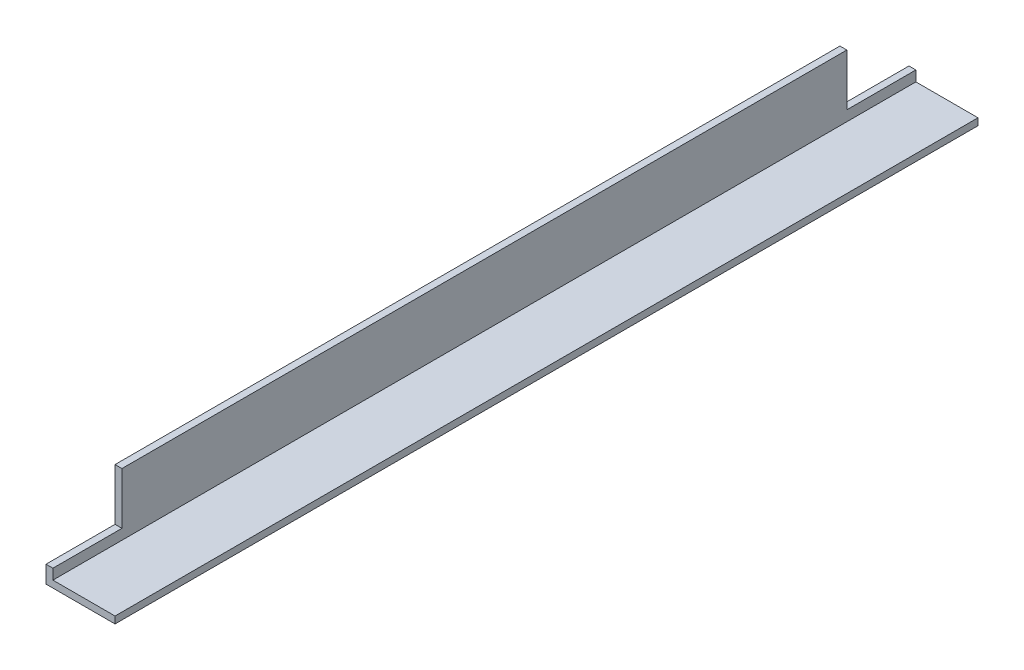
ISO-10303-21;
HEADER;
FILE_DESCRIPTION(('STEP AP214'),'2;1');
FILE_NAME('part.step','',(''),(''),'','','');
FILE_SCHEMA(('AUTOMOTIVE_DESIGN { 1 0 10303 214 1 1 1 1 }'));
ENDSEC;
DATA;
#1=APPLICATION_CONTEXT('core data for automotive mechanical design processes');
#2=APPLICATION_PROTOCOL_DEFINITION('international standard','automotive_design',2000,#1);
#3=PRODUCT_CONTEXT('',#1,'mechanical');
#4=PRODUCT('Part','Part','',(#3));
#5=PRODUCT_RELATED_PRODUCT_CATEGORY('part','',(#4));
#6=PRODUCT_DEFINITION_FORMATION('','',#4);
#7=PRODUCT_DEFINITION_CONTEXT('part definition',#1,'design');
#8=PRODUCT_DEFINITION('design','',#6,#7);
#9=PRODUCT_DEFINITION_SHAPE('','',#8);
#10=(LENGTH_UNIT() NAMED_UNIT(*) SI_UNIT(.MILLI.,.METRE.));
#11=(NAMED_UNIT(*) PLANE_ANGLE_UNIT() SI_UNIT($,.RADIAN.));
#12=(NAMED_UNIT(*) SI_UNIT($,.STERADIAN.) SOLID_ANGLE_UNIT());
#13=UNCERTAINTY_MEASURE_WITH_UNIT(LENGTH_MEASURE(1.E-05),#10,'distance_accuracy_value','');
#14=(GEOMETRIC_REPRESENTATION_CONTEXT(3) GLOBAL_UNCERTAINTY_ASSIGNED_CONTEXT((#13)) GLOBAL_UNIT_ASSIGNED_CONTEXT((#10,
#11,#12)) REPRESENTATION_CONTEXT('',''));
#15=CARTESIAN_POINT('',(0.,0.,0.));
#16=DIRECTION('',(0.,0.,1.));
#17=DIRECTION('',(1.,0.,0.));
#18=AXIS2_PLACEMENT_3D('',#15,#16,#17);
#19=CARTESIAN_POINT('',(40.,0.,500.));
#20=DIRECTION('',(0.,1.,0.));
#21=DIRECTION('',(-1.,0.,0.));
#22=AXIS2_PLACEMENT_3D('',#19,#20,#21);
#23=PLANE('',#22);
#24=DIRECTION('',(1.,0.,0.));
#25=VECTOR('',#24,1.);
#26=CARTESIAN_POINT('',(40.,0.,0.));
#27=LINE('',#26,#25);
#28=CARTESIAN_POINT('',(0.,0.,0.));
#29=VERTEX_POINT('',#28);
#30=CARTESIAN_POINT('',(40.,0.,0.));
#31=VERTEX_POINT('',#30);
#32=EDGE_CURVE('E180',#29,#31,#27,.T.);
#33=ORIENTED_EDGE('',*,*,#32,.T.);
#34=DIRECTION('',(0.,0.,-1.));
#35=VECTOR('',#34,1.);
#36=CARTESIAN_POINT('',(40.,0.,500.));
#37=LINE('',#36,#35);
#38=CARTESIAN_POINT('',(40.,0.,500.));
#39=VERTEX_POINT('',#38);
#40=EDGE_CURVE('E160',#39,#31,#37,.T.);
#41=ORIENTED_EDGE('',*,*,#40,.F.);
#42=DIRECTION('',(1.,0.,0.));
#43=VECTOR('',#42,1.);
#44=CARTESIAN_POINT('',(40.,0.,500.));
#45=LINE('',#44,#43);
#46=CARTESIAN_POINT('',(0.,0.,500.));
#47=VERTEX_POINT('',#46);
#48=EDGE_CURVE('E182',#47,#39,#45,.T.);
#49=ORIENTED_EDGE('',*,*,#48,.F.);
#50=DIRECTION('',(0.,0.,-1.));
#51=VECTOR('',#50,1.);
#52=CARTESIAN_POINT('',(0.,0.,500.));
#53=LINE('',#52,#51);
#54=EDGE_CURVE('E142',#47,#29,#53,.T.);
#55=ORIENTED_EDGE('',*,*,#54,.T.);
#56=EDGE_LOOP('',(#33,#41,#49,#55));
#57=FACE_BOUND('',#56,.T.);
#58=ADVANCED_FACE('F38',(#57),#23,.F.);
#59=CARTESIAN_POINT('',(40.,4.,500.));
#60=DIRECTION('',(-1.,0.,0.));
#61=DIRECTION('',(0.,0.,1.));
#62=AXIS2_PLACEMENT_3D('',#59,#60,#61);
#63=PLANE('',#62);
#64=DIRECTION('',(0.,1.,0.));
#65=VECTOR('',#64,1.);
#66=CARTESIAN_POINT('',(40.,4.,0.));
#67=LINE('',#66,#65);
#68=CARTESIAN_POINT('',(40.,4.,0.));
#69=VERTEX_POINT('',#68);
#70=EDGE_CURVE('E194',#31,#69,#67,.T.);
#71=ORIENTED_EDGE('',*,*,#70,.T.);
#72=DIRECTION('',(0.,0.,-1.));
#73=VECTOR('',#72,1.);
#74=CARTESIAN_POINT('',(40.,4.,500.));
#75=LINE('',#74,#73);
#76=CARTESIAN_POINT('',(40.,4.,500.));
#77=VERTEX_POINT('',#76);
#78=EDGE_CURVE('E156',#77,#69,#75,.T.);
#79=ORIENTED_EDGE('',*,*,#78,.F.);
#80=DIRECTION('',(0.,1.,0.));
#81=VECTOR('',#80,1.);
#82=CARTESIAN_POINT('',(40.,4.,500.));
#83=LINE('',#82,#81);
#84=EDGE_CURVE('E187',#39,#77,#83,.T.);
#85=ORIENTED_EDGE('',*,*,#84,.F.);
#86=ORIENTED_EDGE('',*,*,#40,.T.);
#87=EDGE_LOOP('',(#71,#79,#85,#86));
#88=FACE_BOUND('',#87,.T.);
#89=ADVANCED_FACE('F245',(#88),#63,.F.);
#90=CARTESIAN_POINT('',(4.,4.,500.));
#91=DIRECTION('',(0.,-1.,0.));
#92=DIRECTION('',(0.,0.,-1.));
#93=AXIS2_PLACEMENT_3D('',#90,#91,#92);
#94=PLANE('',#93);
#95=DIRECTION('',(-1.,0.,0.));
#96=VECTOR('',#95,1.);
#97=CARTESIAN_POINT('',(4.,4.,0.));
#98=LINE('',#97,#96);
#99=CARTESIAN_POINT('',(4.,4.,0.));
#100=VERTEX_POINT('',#99);
#101=EDGE_CURVE('E189',#69,#100,#98,.T.);
#102=ORIENTED_EDGE('',*,*,#101,.T.);
#103=DIRECTION('',(0.,0.,-1.));
#104=VECTOR('',#103,1.);
#105=CARTESIAN_POINT('',(4.,4.,500.));
#106=LINE('',#105,#104);
#107=CARTESIAN_POINT('',(4.,4.,500.));
#108=VERTEX_POINT('',#107);
#109=EDGE_CURVE('E146',#108,#100,#106,.T.);
#110=ORIENTED_EDGE('',*,*,#109,.F.);
#111=DIRECTION('',(-1.,0.,0.));
#112=VECTOR('',#111,1.);
#113=CARTESIAN_POINT('',(4.,4.,500.));
#114=LINE('',#113,#112);
#115=EDGE_CURVE('E206',#77,#108,#114,.T.);
#116=ORIENTED_EDGE('',*,*,#115,.F.);
#117=ORIENTED_EDGE('',*,*,#78,.T.);
#118=EDGE_LOOP('',(#102,#110,#116,#117));
#119=FACE_BOUND('',#118,.T.);
#120=ADVANCED_FACE('F241',(#119),#94,.F.);
#121=CARTESIAN_POINT('',(4.,40.,500.));
#122=DIRECTION('',(-1.,0.,0.));
#123=DIRECTION('',(0.,-1.,0.));
#124=AXIS2_PLACEMENT_3D('',#121,#122,#123);
#125=PLANE('',#124);
#126=DIRECTION('',(0.,-1.,0.));
#127=VECTOR('',#126,1.);
#128=CARTESIAN_POINT('',(4.,40.,460.));
#129=LINE('',#128,#127);
#130=CARTESIAN_POINT('',(4.,40.,460.));
#131=VERTEX_POINT('',#130);
#132=CARTESIAN_POINT('',(4.,10.,460.));
#133=VERTEX_POINT('',#132);
#134=EDGE_CURVE('E121',#131,#133,#129,.T.);
#135=ORIENTED_EDGE('',*,*,#134,.T.);
#136=DIRECTION('',(0.,0.,1.));
#137=VECTOR('',#136,1.);
#138=CARTESIAN_POINT('',(4.,10.,500.));
#139=LINE('',#138,#137);
#140=CARTESIAN_POINT('',(4.,10.,500.));
#141=VERTEX_POINT('',#140);
#142=EDGE_CURVE('E225',#133,#141,#139,.T.);
#143=ORIENTED_EDGE('',*,*,#142,.T.);
#144=DIRECTION('',(0.,1.,0.));
#145=VECTOR('',#144,1.);
#146=CARTESIAN_POINT('',(4.,40.,500.));
#147=LINE('',#146,#145);
#148=EDGE_CURVE('E202',#108,#141,#147,.T.);
#149=ORIENTED_EDGE('',*,*,#148,.F.);
#150=ORIENTED_EDGE('',*,*,#109,.T.);
#151=DIRECTION('',(0.,1.,0.));
#152=VECTOR('',#151,1.);
#153=CARTESIAN_POINT('',(4.,40.,0.));
#154=LINE('',#153,#152);
#155=CARTESIAN_POINT('',(4.,10.,0.));
#156=VERTEX_POINT('',#155);
#157=EDGE_CURVE('E183',#100,#156,#154,.T.);
#158=ORIENTED_EDGE('',*,*,#157,.T.);
#159=DIRECTION('',(0.,0.,1.));
#160=VECTOR('',#159,1.);
#161=CARTESIAN_POINT('',(4.,10.,500.));
#162=LINE('',#161,#160);
#163=CARTESIAN_POINT('',(4.,10.,40.));
#164=VERTEX_POINT('',#163);
#165=EDGE_CURVE('E60',#156,#164,#162,.T.);
#166=ORIENTED_EDGE('',*,*,#165,.T.);
#167=DIRECTION('',(0.,1.,0.));
#168=VECTOR('',#167,1.);
#169=CARTESIAN_POINT('',(4.,40.,40.));
#170=LINE('',#169,#168);
#171=CARTESIAN_POINT('',(4.,40.,40.));
#172=VERTEX_POINT('',#171);
#173=EDGE_CURVE('E199',#164,#172,#170,.T.);
#174=ORIENTED_EDGE('',*,*,#173,.T.);
#175=DIRECTION('',(0.,0.,-1.));
#176=VECTOR('',#175,1.);
#177=CARTESIAN_POINT('',(4.,40.,500.));
#178=LINE('',#177,#176);
#179=EDGE_CURVE('E141',#131,#172,#178,.T.);
#180=ORIENTED_EDGE('',*,*,#179,.F.);
#181=EDGE_LOOP('',(#135,#143,#149,#150,#158,#166,#174,#180));
#182=FACE_BOUND('',#181,.T.);
#183=ADVANCED_FACE('F234',(#182),#125,.F.);
#184=CARTESIAN_POINT('',(0.,40.,500.));
#185=DIRECTION('',(0.,-1.,0.));
#186=DIRECTION('',(0.,0.,-1.));
#187=AXIS2_PLACEMENT_3D('',#184,#185,#186);
#188=PLANE('',#187);
#189=DIRECTION('',(0.,0.,-1.));
#190=VECTOR('',#189,1.);
#191=CARTESIAN_POINT('',(0.,40.,500.));
#192=LINE('',#191,#190);
#193=CARTESIAN_POINT('',(0.,40.,460.));
#194=VERTEX_POINT('',#193);
#195=CARTESIAN_POINT('',(0.,40.,40.));
#196=VERTEX_POINT('',#195);
#197=EDGE_CURVE('E132',#194,#196,#192,.T.);
#198=ORIENTED_EDGE('',*,*,#197,.F.);
#199=DIRECTION('',(-1.,0.,0.));
#200=VECTOR('',#199,1.);
#201=CARTESIAN_POINT('',(40.,40.,460.));
#202=LINE('',#201,#200);
#203=EDGE_CURVE('E115',#131,#194,#202,.T.);
#204=ORIENTED_EDGE('',*,*,#203,.F.);
#205=ORIENTED_EDGE('',*,*,#179,.T.);
#206=DIRECTION('',(-1.,0.,0.));
#207=VECTOR('',#206,1.);
#208=CARTESIAN_POINT('',(40.,40.,40.));
#209=LINE('',#208,#207);
#210=EDGE_CURVE('E139',#172,#196,#209,.T.);
#211=ORIENTED_EDGE('',*,*,#210,.T.);
#212=EDGE_LOOP('',(#198,#204,#205,#211));
#213=FACE_BOUND('',#212,.T.);
#214=ADVANCED_FACE('F137',(#213),#188,.F.);
#215=CARTESIAN_POINT('',(0.,0.,500.));
#216=DIRECTION('',(1.,0.,0.));
#217=DIRECTION('',(0.,0.,-1.));
#218=AXIS2_PLACEMENT_3D('',#215,#216,#217);
#219=PLANE('',#218);
#220=DIRECTION('',(0.,-1.,0.));
#221=VECTOR('',#220,1.);
#222=CARTESIAN_POINT('',(0.,0.,500.));
#223=LINE('',#222,#221);
#224=CARTESIAN_POINT('',(0.,10.,500.));
#225=VERTEX_POINT('',#224);
#226=EDGE_CURVE('E149',#225,#47,#223,.T.);
#227=ORIENTED_EDGE('',*,*,#226,.F.);
#228=DIRECTION('',(0.,0.,1.));
#229=VECTOR('',#228,1.);
#230=CARTESIAN_POINT('',(0.,10.,500.));
#231=LINE('',#230,#229);
#232=CARTESIAN_POINT('',(0.,10.,460.));
#233=VERTEX_POINT('',#232);
#234=EDGE_CURVE('E53',#233,#225,#231,.T.);
#235=ORIENTED_EDGE('',*,*,#234,.F.);
#236=DIRECTION('',(0.,-1.,0.));
#237=VECTOR('',#236,1.);
#238=CARTESIAN_POINT('',(0.,10.,460.));
#239=LINE('',#238,#237);
#240=EDGE_CURVE('E119',#194,#233,#239,.T.);
#241=ORIENTED_EDGE('',*,*,#240,.F.);
#242=ORIENTED_EDGE('',*,*,#197,.T.);
#243=DIRECTION('',(0.,1.,0.));
#244=VECTOR('',#243,1.);
#245=CARTESIAN_POINT('',(0.,10.,40.));
#246=LINE('',#245,#244);
#247=CARTESIAN_POINT('',(0.,10.,40.));
#248=VERTEX_POINT('',#247);
#249=EDGE_CURVE('E174',#248,#196,#246,.T.);
#250=ORIENTED_EDGE('',*,*,#249,.F.);
#251=DIRECTION('',(0.,0.,1.));
#252=VECTOR('',#251,1.);
#253=CARTESIAN_POINT('',(0.,10.,0.));
#254=LINE('',#253,#252);
#255=CARTESIAN_POINT('',(0.,10.,0.));
#256=VERTEX_POINT('',#255);
#257=EDGE_CURVE('E167',#256,#248,#254,.T.);
#258=ORIENTED_EDGE('',*,*,#257,.F.);
#259=DIRECTION('',(0.,-1.,0.));
#260=VECTOR('',#259,1.);
#261=CARTESIAN_POINT('',(0.,0.,0.));
#262=LINE('',#261,#260);
#263=EDGE_CURVE('E173',#256,#29,#262,.T.);
#264=ORIENTED_EDGE('',*,*,#263,.T.);
#265=ORIENTED_EDGE('',*,*,#54,.F.);
#266=EDGE_LOOP('',(#227,#235,#241,#242,#250,#258,#264,#265));
#267=FACE_BOUND('',#266,.T.);
#268=ADVANCED_FACE('F130',(#267),#219,.F.);
#269=CARTESIAN_POINT('',(0.,0.,500.));
#270=DIRECTION('',(0.,0.,-1.));
#271=DIRECTION('',(-1.,0.,0.));
#272=AXIS2_PLACEMENT_3D('',#269,#270,#271);
#273=PLANE('',#272);
#274=ORIENTED_EDGE('',*,*,#148,.T.);
#275=DIRECTION('',(-1.,0.,0.));
#276=VECTOR('',#275,1.);
#277=CARTESIAN_POINT('',(0.,10.,500.));
#278=LINE('',#277,#276);
#279=EDGE_CURVE('E11',#141,#225,#278,.T.);
#280=ORIENTED_EDGE('',*,*,#279,.T.);
#281=ORIENTED_EDGE('',*,*,#226,.T.);
#282=ORIENTED_EDGE('',*,*,#48,.T.);
#283=ORIENTED_EDGE('',*,*,#84,.T.);
#284=ORIENTED_EDGE('',*,*,#115,.T.);
#285=EDGE_LOOP('',(#274,#280,#281,#282,#283,#284));
#286=FACE_BOUND('',#285,.T.);
#287=ADVANCED_FACE('F250',(#286),#273,.F.);
#288=CARTESIAN_POINT('',(0.,0.,0.));
#289=DIRECTION('',(0.,0.,-1.));
#290=DIRECTION('',(-1.,0.,0.));
#291=AXIS2_PLACEMENT_3D('',#288,#289,#290);
#292=PLANE('',#291);
#293=DIRECTION('',(-1.,0.,0.));
#294=VECTOR('',#293,1.);
#295=CARTESIAN_POINT('',(0.,10.,0.));
#296=LINE('',#295,#294);
#297=EDGE_CURVE('E46',#156,#256,#296,.T.);
#298=ORIENTED_EDGE('',*,*,#297,.F.);
#299=ORIENTED_EDGE('',*,*,#157,.F.);
#300=ORIENTED_EDGE('',*,*,#101,.F.);
#301=ORIENTED_EDGE('',*,*,#70,.F.);
#302=ORIENTED_EDGE('',*,*,#32,.F.);
#303=ORIENTED_EDGE('',*,*,#263,.F.);
#304=EDGE_LOOP('',(#298,#299,#300,#301,#302,#303));
#305=FACE_BOUND('',#304,.T.);
#306=ADVANCED_FACE('F178',(#305),#292,.T.);
#307=CARTESIAN_POINT('',(40.,10.,40.));
#308=DIRECTION('',(0.,0.,1.));
#309=DIRECTION('',(1.,0.,0.));
#310=AXIS2_PLACEMENT_3D('',#307,#308,#309);
#311=PLANE('',#310);
#312=DIRECTION('',(-1.,0.,0.));
#313=VECTOR('',#312,1.);
#314=CARTESIAN_POINT('',(40.,10.,40.));
#315=LINE('',#314,#313);
#316=EDGE_CURVE('E216',#164,#248,#315,.T.);
#317=ORIENTED_EDGE('',*,*,#316,.T.);
#318=ORIENTED_EDGE('',*,*,#249,.T.);
#319=ORIENTED_EDGE('',*,*,#210,.F.);
#320=ORIENTED_EDGE('',*,*,#173,.F.);
#321=EDGE_LOOP('',(#317,#318,#319,#320));
#322=FACE_BOUND('',#321,.T.);
#323=ADVANCED_FACE('F237',(#322),#311,.F.);
#324=CARTESIAN_POINT('',(40.,10.,0.));
#325=DIRECTION('',(0.,-1.,0.));
#326=DIRECTION('',(0.,0.,-1.));
#327=AXIS2_PLACEMENT_3D('',#324,#325,#326);
#328=PLANE('',#327);
#329=ORIENTED_EDGE('',*,*,#297,.T.);
#330=ORIENTED_EDGE('',*,*,#257,.T.);
#331=ORIENTED_EDGE('',*,*,#316,.F.);
#332=ORIENTED_EDGE('',*,*,#165,.F.);
#333=EDGE_LOOP('',(#329,#330,#331,#332));
#334=FACE_BOUND('',#333,.T.);
#335=ADVANCED_FACE('F166',(#334),#328,.F.);
#336=CARTESIAN_POINT('',(40.,10.,460.));
#337=DIRECTION('',(0.,0.,-1.));
#338=DIRECTION('',(-1.,0.,0.));
#339=AXIS2_PLACEMENT_3D('',#336,#337,#338);
#340=PLANE('',#339);
#341=ORIENTED_EDGE('',*,*,#203,.T.);
#342=ORIENTED_EDGE('',*,*,#240,.T.);
#343=DIRECTION('',(-1.,0.,0.));
#344=VECTOR('',#343,1.);
#345=CARTESIAN_POINT('',(40.,10.,460.));
#346=LINE('',#345,#344);
#347=EDGE_CURVE('E126',#133,#233,#346,.T.);
#348=ORIENTED_EDGE('',*,*,#347,.F.);
#349=ORIENTED_EDGE('',*,*,#134,.F.);
#350=EDGE_LOOP('',(#341,#342,#348,#349));
#351=FACE_BOUND('',#350,.T.);
#352=ADVANCED_FACE('F117',(#351),#340,.F.);
#353=CARTESIAN_POINT('',(40.,10.,500.));
#354=DIRECTION('',(0.,-1.,0.));
#355=DIRECTION('',(0.,0.,-1.));
#356=AXIS2_PLACEMENT_3D('',#353,#354,#355);
#357=PLANE('',#356);
#358=ORIENTED_EDGE('',*,*,#347,.T.);
#359=ORIENTED_EDGE('',*,*,#234,.T.);
#360=ORIENTED_EDGE('',*,*,#279,.F.);
#361=ORIENTED_EDGE('',*,*,#142,.F.);
#362=EDGE_LOOP('',(#358,#359,#360,#361));
#363=FACE_BOUND('',#362,.T.);
#364=ADVANCED_FACE('F232',(#363),#357,.F.);
#365=CLOSED_SHELL('',(#58,#89,#120,#183,#214,#268,#287,#306,#323,#335,#352,#364));
#366=MANIFOLD_SOLID_BREP('B2',#365);
#367=ADVANCED_BREP_SHAPE_REPRESENTATION('',(#18,#366),#14);
#368=SHAPE_DEFINITION_REPRESENTATION(#9,#367);
ENDSEC;
END-ISO-10303-21;
